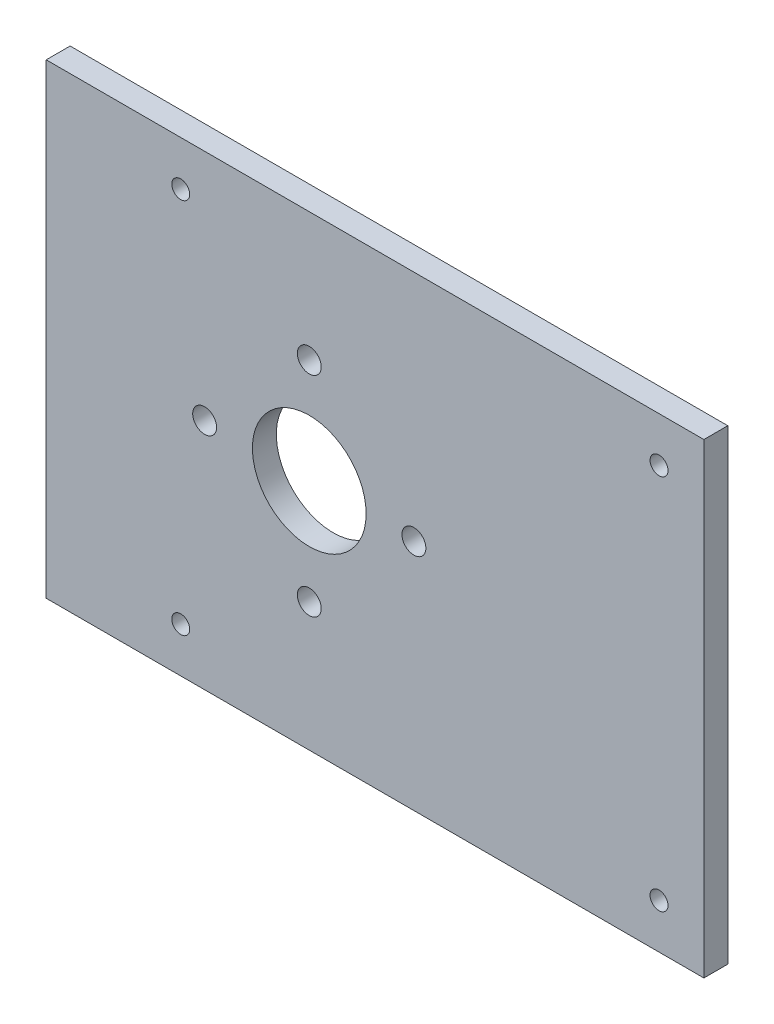
ISO-10303-21;
HEADER;
FILE_DESCRIPTION(('STEP AP214'),'2;1');
FILE_NAME('part.step','',(''),(''),'','','');
FILE_SCHEMA(('AUTOMOTIVE_DESIGN { 1 0 10303 214 1 1 1 1 }'));
ENDSEC;
DATA;
#1=APPLICATION_CONTEXT('core data for automotive mechanical design processes');
#2=APPLICATION_PROTOCOL_DEFINITION('international standard','automotive_design',2000,#1);
#3=PRODUCT_CONTEXT('',#1,'mechanical');
#4=PRODUCT('Part','Part','',(#3));
#5=PRODUCT_RELATED_PRODUCT_CATEGORY('part','',(#4));
#6=PRODUCT_DEFINITION_FORMATION('','',#4);
#7=PRODUCT_DEFINITION_CONTEXT('part definition',#1,'design');
#8=PRODUCT_DEFINITION('design','',#6,#7);
#9=PRODUCT_DEFINITION_SHAPE('','',#8);
#10=(LENGTH_UNIT() NAMED_UNIT(*) SI_UNIT(.MILLI.,.METRE.));
#11=(NAMED_UNIT(*) PLANE_ANGLE_UNIT() SI_UNIT($,.RADIAN.));
#12=(NAMED_UNIT(*) SI_UNIT($,.STERADIAN.) SOLID_ANGLE_UNIT());
#13=UNCERTAINTY_MEASURE_WITH_UNIT(LENGTH_MEASURE(1.E-05),#10,'distance_accuracy_value','');
#14=(GEOMETRIC_REPRESENTATION_CONTEXT(3) GLOBAL_UNCERTAINTY_ASSIGNED_CONTEXT((#13)) GLOBAL_UNIT_ASSIGNED_CONTEXT((#10,
#11,#12)) REPRESENTATION_CONTEXT('',''));
#15=CARTESIAN_POINT('',(0.,0.,0.));
#16=DIRECTION('',(0.,0.,1.));
#17=DIRECTION('',(1.,0.,0.));
#18=AXIS2_PLACEMENT_3D('',#15,#16,#17);
#19=CARTESIAN_POINT('',(0.,0.,4.));
#20=DIRECTION('',(0.,0.,1.));
#21=DIRECTION('',(1.,0.,0.));
#22=AXIS2_PLACEMENT_3D('',#19,#20,#21);
#23=PLANE('',#22);
#24=CARTESIAN_POINT('',(-11.,17.5,4.));
#25=DIRECTION('',(0.,0.,1.));
#26=DIRECTION('',(1.,0.,0.));
#27=AXIS2_PLACEMENT_3D('',#24,#25,#26);
#28=CIRCLE('',#27,2.);
#29=CARTESIAN_POINT('',(-9.00000000000003,17.5,4.));
#30=VERTEX_POINT('',#29);
#31=EDGE_CURVE('E153',#30,#30,#28,.T.);
#32=ORIENTED_EDGE('',*,*,#31,.F.);
#33=EDGE_LOOP('',(#32));
#34=FACE_BOUND('',#33,.T.);
#35=CARTESIAN_POINT('',(-28.5,0.,4.));
#36=DIRECTION('',(0.,0.,1.));
#37=DIRECTION('',(1.,0.,0.));
#38=AXIS2_PLACEMENT_3D('',#35,#36,#37);
#39=CIRCLE('',#38,2.);
#40=CARTESIAN_POINT('',(-26.5,0.,4.));
#41=VERTEX_POINT('',#40);
#42=EDGE_CURVE('E146',#41,#41,#39,.T.);
#43=ORIENTED_EDGE('',*,*,#42,.F.);
#44=EDGE_LOOP('',(#43));
#45=FACE_BOUND('',#44,.T.);
#46=CARTESIAN_POINT('',(-11.,-17.5,4.));
#47=DIRECTION('',(0.,0.,1.));
#48=DIRECTION('',(1.,0.,0.));
#49=AXIS2_PLACEMENT_3D('',#46,#47,#48);
#50=CIRCLE('',#49,2.);
#51=CARTESIAN_POINT('',(-9.00000000000003,-17.5,4.));
#52=VERTEX_POINT('',#51);
#53=EDGE_CURVE('E164',#52,#52,#50,.T.);
#54=ORIENTED_EDGE('',*,*,#53,.F.);
#55=EDGE_LOOP('',(#54));
#56=FACE_BOUND('',#55,.T.);
#57=CARTESIAN_POINT('',(6.49999999999997,0.,4.));
#58=DIRECTION('',(0.,0.,1.));
#59=DIRECTION('',(1.,0.,0.));
#60=AXIS2_PLACEMENT_3D('',#57,#58,#59);
#61=CIRCLE('',#60,2.);
#62=CARTESIAN_POINT('',(8.49999999999998,0.,4.));
#63=VERTEX_POINT('',#62);
#64=EDGE_CURVE('E158',#63,#63,#61,.T.);
#65=ORIENTED_EDGE('',*,*,#64,.F.);
#66=EDGE_LOOP('',(#65));
#67=FACE_BOUND('',#66,.T.);
#68=CARTESIAN_POINT('',(-11.,0.,4.));
#69=DIRECTION('',(0.,0.,1.));
#70=DIRECTION('',(1.,0.,0.));
#71=AXIS2_PLACEMENT_3D('',#68,#69,#70);
#72=CIRCLE('',#71,9.51);
#73=CARTESIAN_POINT('',(-1.49000000000003,0.,4.));
#74=VERTEX_POINT('',#73);
#75=EDGE_CURVE('E140',#74,#74,#72,.T.);
#76=ORIENTED_EDGE('',*,*,#75,.F.);
#77=EDGE_LOOP('',(#76));
#78=FACE_BOUND('',#77,.T.);
#79=CARTESIAN_POINT('',(47.5,-31.5,4.));
#80=DIRECTION('',(0.,0.,1.));
#81=DIRECTION('',(1.,0.,0.));
#82=AXIS2_PLACEMENT_3D('',#79,#80,#81);
#83=CIRCLE('',#82,1.5);
#84=CARTESIAN_POINT('',(49.,-31.5,4.));
#85=VERTEX_POINT('',#84);
#86=EDGE_CURVE('E125',#85,#85,#83,.T.);
#87=ORIENTED_EDGE('',*,*,#86,.F.);
#88=EDGE_LOOP('',(#87));
#89=FACE_BOUND('',#88,.T.);
#90=CARTESIAN_POINT('',(-32.5,31.5,4.));
#91=DIRECTION('',(0.,0.,1.));
#92=DIRECTION('',(1.,0.,0.));
#93=AXIS2_PLACEMENT_3D('',#90,#91,#92);
#94=CIRCLE('',#93,1.5);
#95=CARTESIAN_POINT('',(-31.,31.5,4.));
#96=VERTEX_POINT('',#95);
#97=EDGE_CURVE('E104',#96,#96,#94,.T.);
#98=ORIENTED_EDGE('',*,*,#97,.F.);
#99=EDGE_LOOP('',(#98));
#100=FACE_BOUND('',#99,.T.);
#101=DIRECTION('',(0.,1.,0.));
#102=VECTOR('',#101,1.);
#103=CARTESIAN_POINT('',(55.,39.,4.));
#104=LINE('',#103,#102);
#105=CARTESIAN_POINT('',(55.,-39.,4.));
#106=VERTEX_POINT('',#105);
#107=CARTESIAN_POINT('',(55.,39.,4.));
#108=VERTEX_POINT('',#107);
#109=EDGE_CURVE('E89',#106,#108,#104,.T.);
#110=ORIENTED_EDGE('',*,*,#109,.T.);
#111=DIRECTION('',(-1.,0.,0.));
#112=VECTOR('',#111,1.);
#113=CARTESIAN_POINT('',(-55.,39.,4.));
#114=LINE('',#113,#112);
#115=CARTESIAN_POINT('',(-55.,39.,4.));
#116=VERTEX_POINT('',#115);
#117=EDGE_CURVE('E84',#108,#116,#114,.T.);
#118=ORIENTED_EDGE('',*,*,#117,.T.);
#119=DIRECTION('',(0.,-1.,0.));
#120=VECTOR('',#119,1.);
#121=CARTESIAN_POINT('',(-55.,39.,4.));
#122=LINE('',#121,#120);
#123=CARTESIAN_POINT('',(-55.,-39.,4.));
#124=VERTEX_POINT('',#123);
#125=EDGE_CURVE('E87',#116,#124,#122,.T.);
#126=ORIENTED_EDGE('',*,*,#125,.T.);
#127=DIRECTION('',(1.,0.,0.));
#128=VECTOR('',#127,1.);
#129=CARTESIAN_POINT('',(-55.,-39.,4.));
#130=LINE('',#129,#128);
#131=EDGE_CURVE('E54',#124,#106,#130,.T.);
#132=ORIENTED_EDGE('',*,*,#131,.T.);
#133=EDGE_LOOP('',(#110,#118,#126,#132));
#134=FACE_BOUND('',#133,.T.);
#135=CARTESIAN_POINT('',(47.5,31.5,4.));
#136=DIRECTION('',(0.,0.,1.));
#137=DIRECTION('',(1.,0.,0.));
#138=AXIS2_PLACEMENT_3D('',#135,#136,#137);
#139=CIRCLE('',#138,1.5);
#140=CARTESIAN_POINT('',(49.,31.5,4.));
#141=VERTEX_POINT('',#140);
#142=EDGE_CURVE('E119',#141,#141,#139,.T.);
#143=ORIENTED_EDGE('',*,*,#142,.F.);
#144=EDGE_LOOP('',(#143));
#145=FACE_BOUND('',#144,.T.);
#146=CARTESIAN_POINT('',(-32.5,-31.5,4.));
#147=DIRECTION('',(0.,0.,1.));
#148=DIRECTION('',(1.,0.,0.));
#149=AXIS2_PLACEMENT_3D('',#146,#147,#148);
#150=CIRCLE('',#149,1.5);
#151=CARTESIAN_POINT('',(-31.,-31.5,4.));
#152=VERTEX_POINT('',#151);
#153=EDGE_CURVE('E131',#152,#152,#150,.T.);
#154=ORIENTED_EDGE('',*,*,#153,.F.);
#155=EDGE_LOOP('',(#154));
#156=FACE_BOUND('',#155,.T.);
#157=ADVANCED_FACE('F37',(#34,#45,#56,#67,#78,#89,#100,#134,#145,#156),#23,.T.);
#158=CARTESIAN_POINT('',(0.,0.,0.));
#159=DIRECTION('',(0.,0.,1.));
#160=DIRECTION('',(1.,0.,0.));
#161=AXIS2_PLACEMENT_3D('',#158,#159,#160);
#162=PLANE('',#161);
#163=CARTESIAN_POINT('',(-11.,17.5,0.));
#164=DIRECTION('',(0.,0.,1.));
#165=DIRECTION('',(1.,0.,0.));
#166=AXIS2_PLACEMENT_3D('',#163,#164,#165);
#167=CIRCLE('',#166,2.);
#168=CARTESIAN_POINT('',(-9.00000000000003,17.5,0.));
#169=VERTEX_POINT('',#168);
#170=EDGE_CURVE('E143',#169,#169,#167,.T.);
#171=ORIENTED_EDGE('',*,*,#170,.T.);
#172=EDGE_LOOP('',(#171));
#173=FACE_BOUND('',#172,.T.);
#174=CARTESIAN_POINT('',(-28.5,0.,0.));
#175=DIRECTION('',(0.,0.,1.));
#176=DIRECTION('',(1.,0.,0.));
#177=AXIS2_PLACEMENT_3D('',#174,#175,#176);
#178=CIRCLE('',#177,2.);
#179=CARTESIAN_POINT('',(-26.5,0.,0.));
#180=VERTEX_POINT('',#179);
#181=EDGE_CURVE('E149',#180,#180,#178,.T.);
#182=ORIENTED_EDGE('',*,*,#181,.T.);
#183=EDGE_LOOP('',(#182));
#184=FACE_BOUND('',#183,.T.);
#185=CARTESIAN_POINT('',(-11.,-17.5,0.));
#186=DIRECTION('',(0.,0.,1.));
#187=DIRECTION('',(1.,0.,0.));
#188=AXIS2_PLACEMENT_3D('',#185,#186,#187);
#189=CIRCLE('',#188,2.);
#190=CARTESIAN_POINT('',(-9.00000000000003,-17.5,0.));
#191=VERTEX_POINT('',#190);
#192=EDGE_CURVE('E150',#191,#191,#189,.T.);
#193=ORIENTED_EDGE('',*,*,#192,.T.);
#194=EDGE_LOOP('',(#193));
#195=FACE_BOUND('',#194,.T.);
#196=CARTESIAN_POINT('',(6.49999999999997,0.,0.));
#197=DIRECTION('',(0.,0.,1.));
#198=DIRECTION('',(1.,0.,0.));
#199=AXIS2_PLACEMENT_3D('',#196,#197,#198);
#200=CIRCLE('',#199,2.);
#201=CARTESIAN_POINT('',(8.49999999999998,0.,0.));
#202=VERTEX_POINT('',#201);
#203=EDGE_CURVE('E161',#202,#202,#200,.T.);
#204=ORIENTED_EDGE('',*,*,#203,.T.);
#205=EDGE_LOOP('',(#204));
#206=FACE_BOUND('',#205,.T.);
#207=CARTESIAN_POINT('',(-11.,0.,0.));
#208=DIRECTION('',(0.,0.,1.));
#209=DIRECTION('',(1.,0.,0.));
#210=AXIS2_PLACEMENT_3D('',#207,#208,#209);
#211=CIRCLE('',#210,9.51);
#212=CARTESIAN_POINT('',(-1.49000000000003,0.,0.));
#213=VERTEX_POINT('',#212);
#214=EDGE_CURVE('E137',#213,#213,#211,.T.);
#215=ORIENTED_EDGE('',*,*,#214,.T.);
#216=EDGE_LOOP('',(#215));
#217=FACE_BOUND('',#216,.T.);
#218=DIRECTION('',(0.,1.,0.));
#219=VECTOR('',#218,1.);
#220=CARTESIAN_POINT('',(55.,39.,0.));
#221=LINE('',#220,#219);
#222=CARTESIAN_POINT('',(55.,-39.,0.));
#223=VERTEX_POINT('',#222);
#224=CARTESIAN_POINT('',(55.,39.,0.));
#225=VERTEX_POINT('',#224);
#226=EDGE_CURVE('E101',#223,#225,#221,.T.);
#227=ORIENTED_EDGE('',*,*,#226,.F.);
#228=DIRECTION('',(1.,0.,0.));
#229=VECTOR('',#228,1.);
#230=CARTESIAN_POINT('',(-55.,-39.,0.));
#231=LINE('',#230,#229);
#232=CARTESIAN_POINT('',(-55.,-39.,0.));
#233=VERTEX_POINT('',#232);
#234=EDGE_CURVE('E77',#233,#223,#231,.T.);
#235=ORIENTED_EDGE('',*,*,#234,.F.);
#236=DIRECTION('',(0.,-1.,0.));
#237=VECTOR('',#236,1.);
#238=CARTESIAN_POINT('',(-55.,39.,0.));
#239=LINE('',#238,#237);
#240=CARTESIAN_POINT('',(-55.,39.,0.));
#241=VERTEX_POINT('',#240);
#242=EDGE_CURVE('E71',#241,#233,#239,.T.);
#243=ORIENTED_EDGE('',*,*,#242,.F.);
#244=DIRECTION('',(-1.,0.,0.));
#245=VECTOR('',#244,1.);
#246=CARTESIAN_POINT('',(-55.,39.,0.));
#247=LINE('',#246,#245);
#248=EDGE_CURVE('E93',#225,#241,#247,.T.);
#249=ORIENTED_EDGE('',*,*,#248,.F.);
#250=EDGE_LOOP('',(#227,#235,#243,#249));
#251=FACE_BOUND('',#250,.T.);
#252=CARTESIAN_POINT('',(-32.5,31.5,0.));
#253=DIRECTION('',(0.,0.,1.));
#254=DIRECTION('',(1.,0.,0.));
#255=AXIS2_PLACEMENT_3D('',#252,#253,#254);
#256=CIRCLE('',#255,1.5);
#257=CARTESIAN_POINT('',(-31.,31.5,0.));
#258=VERTEX_POINT('',#257);
#259=EDGE_CURVE('E116',#258,#258,#256,.T.);
#260=ORIENTED_EDGE('',*,*,#259,.T.);
#261=EDGE_LOOP('',(#260));
#262=FACE_BOUND('',#261,.T.);
#263=CARTESIAN_POINT('',(47.5,31.5,0.));
#264=DIRECTION('',(0.,0.,1.));
#265=DIRECTION('',(1.,0.,0.));
#266=AXIS2_PLACEMENT_3D('',#263,#264,#265);
#267=CIRCLE('',#266,1.5);
#268=CARTESIAN_POINT('',(49.,31.5,0.));
#269=VERTEX_POINT('',#268);
#270=EDGE_CURVE('E122',#269,#269,#267,.T.);
#271=ORIENTED_EDGE('',*,*,#270,.T.);
#272=EDGE_LOOP('',(#271));
#273=FACE_BOUND('',#272,.T.);
#274=CARTESIAN_POINT('',(47.5,-31.5,0.));
#275=DIRECTION('',(0.,0.,1.));
#276=DIRECTION('',(1.,0.,0.));
#277=AXIS2_PLACEMENT_3D('',#274,#275,#276);
#278=CIRCLE('',#277,1.5);
#279=CARTESIAN_POINT('',(49.,-31.5,0.));
#280=VERTEX_POINT('',#279);
#281=EDGE_CURVE('E128',#280,#280,#278,.T.);
#282=ORIENTED_EDGE('',*,*,#281,.T.);
#283=EDGE_LOOP('',(#282));
#284=FACE_BOUND('',#283,.T.);
#285=CARTESIAN_POINT('',(-32.5,-31.5,0.));
#286=DIRECTION('',(0.,0.,1.));
#287=DIRECTION('',(1.,0.,0.));
#288=AXIS2_PLACEMENT_3D('',#285,#286,#287);
#289=CIRCLE('',#288,1.5);
#290=CARTESIAN_POINT('',(-31.,-31.5,0.));
#291=VERTEX_POINT('',#290);
#292=EDGE_CURVE('E134',#291,#291,#289,.T.);
#293=ORIENTED_EDGE('',*,*,#292,.T.);
#294=EDGE_LOOP('',(#293));
#295=FACE_BOUND('',#294,.T.);
#296=ADVANCED_FACE('F112',(#173,#184,#195,#206,#217,#251,#262,#273,#284,#295),#162,.F.);
#297=CARTESIAN_POINT('',(55.,39.,4.));
#298=DIRECTION('',(-1.,0.,0.));
#299=DIRECTION('',(0.,-1.,0.));
#300=AXIS2_PLACEMENT_3D('',#297,#298,#299);
#301=PLANE('',#300);
#302=ORIENTED_EDGE('',*,*,#226,.T.);
#303=DIRECTION('',(0.,0.,-1.));
#304=VECTOR('',#303,1.);
#305=CARTESIAN_POINT('',(55.,39.,4.));
#306=LINE('',#305,#304);
#307=EDGE_CURVE('E11',#108,#225,#306,.T.);
#308=ORIENTED_EDGE('',*,*,#307,.F.);
#309=ORIENTED_EDGE('',*,*,#109,.F.);
#310=DIRECTION('',(0.,0.,-1.));
#311=VECTOR('',#310,1.);
#312=CARTESIAN_POINT('',(55.,-39.,4.));
#313=LINE('',#312,#311);
#314=EDGE_CURVE('E97',#106,#223,#313,.T.);
#315=ORIENTED_EDGE('',*,*,#314,.T.);
#316=EDGE_LOOP('',(#302,#308,#309,#315));
#317=FACE_BOUND('',#316,.T.);
#318=ADVANCED_FACE('F39',(#317),#301,.F.);
#319=CARTESIAN_POINT('',(-55.,39.,4.));
#320=DIRECTION('',(0.,-1.,0.));
#321=DIRECTION('',(1.,0.,0.));
#322=AXIS2_PLACEMENT_3D('',#319,#320,#321);
#323=PLANE('',#322);
#324=ORIENTED_EDGE('',*,*,#248,.T.);
#325=DIRECTION('',(0.,0.,-1.));
#326=VECTOR('',#325,1.);
#327=CARTESIAN_POINT('',(-55.,39.,4.));
#328=LINE('',#327,#326);
#329=EDGE_CURVE('E46',#116,#241,#328,.T.);
#330=ORIENTED_EDGE('',*,*,#329,.F.);
#331=ORIENTED_EDGE('',*,*,#117,.F.);
#332=ORIENTED_EDGE('',*,*,#307,.T.);
#333=EDGE_LOOP('',(#324,#330,#331,#332));
#334=FACE_BOUND('',#333,.T.);
#335=ADVANCED_FACE('F92',(#334),#323,.F.);
#336=CARTESIAN_POINT('',(-55.,39.,4.));
#337=DIRECTION('',(1.,0.,0.));
#338=DIRECTION('',(0.,0.,-1.));
#339=AXIS2_PLACEMENT_3D('',#336,#337,#338);
#340=PLANE('',#339);
#341=ORIENTED_EDGE('',*,*,#242,.T.);
#342=DIRECTION('',(0.,0.,-1.));
#343=VECTOR('',#342,1.);
#344=CARTESIAN_POINT('',(-55.,-39.,4.));
#345=LINE('',#344,#343);
#346=EDGE_CURVE('E94',#124,#233,#345,.T.);
#347=ORIENTED_EDGE('',*,*,#346,.F.);
#348=ORIENTED_EDGE('',*,*,#125,.F.);
#349=ORIENTED_EDGE('',*,*,#329,.T.);
#350=EDGE_LOOP('',(#341,#347,#348,#349));
#351=FACE_BOUND('',#350,.T.);
#352=ADVANCED_FACE('F95',(#351),#340,.F.);
#353=CARTESIAN_POINT('',(-55.,-39.,4.));
#354=DIRECTION('',(0.,1.,0.));
#355=DIRECTION('',(0.,0.,1.));
#356=AXIS2_PLACEMENT_3D('',#353,#354,#355);
#357=PLANE('',#356);
#358=ORIENTED_EDGE('',*,*,#234,.T.);
#359=ORIENTED_EDGE('',*,*,#314,.F.);
#360=ORIENTED_EDGE('',*,*,#131,.F.);
#361=ORIENTED_EDGE('',*,*,#346,.T.);
#362=EDGE_LOOP('',(#358,#359,#360,#361));
#363=FACE_BOUND('',#362,.T.);
#364=ADVANCED_FACE('F109',(#363),#357,.F.);
#365=CARTESIAN_POINT('',(-32.5,31.5,4.));
#366=DIRECTION('',(0.,0.,-1.));
#367=DIRECTION('',(-1.,0.,0.));
#368=AXIS2_PLACEMENT_3D('',#365,#366,#367);
#369=CYLINDRICAL_SURFACE('',#368,1.5);
#370=ORIENTED_EDGE('',*,*,#97,.T.);
#371=EDGE_LOOP('',(#370));
#372=FACE_BOUND('',#371,.T.);
#373=ORIENTED_EDGE('',*,*,#259,.F.);
#374=EDGE_LOOP('',(#373));
#375=FACE_BOUND('',#374,.T.);
#376=ADVANCED_FACE('F192',(#372,#375),#369,.F.);
#377=CARTESIAN_POINT('',(47.5,31.5,4.));
#378=DIRECTION('',(0.,0.,-1.));
#379=DIRECTION('',(-1.,0.,0.));
#380=AXIS2_PLACEMENT_3D('',#377,#378,#379);
#381=CYLINDRICAL_SURFACE('',#380,1.5);
#382=ORIENTED_EDGE('',*,*,#142,.T.);
#383=EDGE_LOOP('',(#382));
#384=FACE_BOUND('',#383,.T.);
#385=ORIENTED_EDGE('',*,*,#270,.F.);
#386=EDGE_LOOP('',(#385));
#387=FACE_BOUND('',#386,.T.);
#388=ADVANCED_FACE('F195',(#384,#387),#381,.F.);
#389=CARTESIAN_POINT('',(47.5,-31.5,4.));
#390=DIRECTION('',(0.,0.,-1.));
#391=DIRECTION('',(-1.,0.,0.));
#392=AXIS2_PLACEMENT_3D('',#389,#390,#391);
#393=CYLINDRICAL_SURFACE('',#392,1.5);
#394=ORIENTED_EDGE('',*,*,#86,.T.);
#395=EDGE_LOOP('',(#394));
#396=FACE_BOUND('',#395,.T.);
#397=ORIENTED_EDGE('',*,*,#281,.F.);
#398=EDGE_LOOP('',(#397));
#399=FACE_BOUND('',#398,.T.);
#400=ADVANCED_FACE('F211',(#396,#399),#393,.F.);
#401=CARTESIAN_POINT('',(-32.5,-31.5,4.));
#402=DIRECTION('',(0.,0.,-1.));
#403=DIRECTION('',(-1.,0.,0.));
#404=AXIS2_PLACEMENT_3D('',#401,#402,#403);
#405=CYLINDRICAL_SURFACE('',#404,1.5);
#406=ORIENTED_EDGE('',*,*,#153,.T.);
#407=EDGE_LOOP('',(#406));
#408=FACE_BOUND('',#407,.T.);
#409=ORIENTED_EDGE('',*,*,#292,.F.);
#410=EDGE_LOOP('',(#409));
#411=FACE_BOUND('',#410,.T.);
#412=ADVANCED_FACE('F208',(#408,#411),#405,.F.);
#413=CARTESIAN_POINT('',(-11.,0.,0.));
#414=DIRECTION('',(0.,0.,1.));
#415=DIRECTION('',(1.,0.,0.));
#416=AXIS2_PLACEMENT_3D('',#413,#414,#415);
#417=CYLINDRICAL_SURFACE('',#416,9.51);
#418=ORIENTED_EDGE('',*,*,#214,.F.);
#419=EDGE_LOOP('',(#418));
#420=FACE_BOUND('',#419,.T.);
#421=ORIENTED_EDGE('',*,*,#75,.T.);
#422=EDGE_LOOP('',(#421));
#423=FACE_BOUND('',#422,.T.);
#424=ADVANCED_FACE('F210',(#420,#423),#417,.F.);
#425=CARTESIAN_POINT('',(6.49999999999997,0.,0.));
#426=DIRECTION('',(0.,0.,1.));
#427=DIRECTION('',(1.,0.,0.));
#428=AXIS2_PLACEMENT_3D('',#425,#426,#427);
#429=CYLINDRICAL_SURFACE('',#428,2.);
#430=ORIENTED_EDGE('',*,*,#203,.F.);
#431=EDGE_LOOP('',(#430));
#432=FACE_BOUND('',#431,.T.);
#433=ORIENTED_EDGE('',*,*,#64,.T.);
#434=EDGE_LOOP('',(#433));
#435=FACE_BOUND('',#434,.T.);
#436=ADVANCED_FACE('F176',(#432,#435),#429,.F.);
#437=CARTESIAN_POINT('',(-11.,-17.5,0.));
#438=DIRECTION('',(0.,0.,1.));
#439=DIRECTION('',(1.,0.,0.));
#440=AXIS2_PLACEMENT_3D('',#437,#438,#439);
#441=CYLINDRICAL_SURFACE('',#440,2.);
#442=ORIENTED_EDGE('',*,*,#192,.F.);
#443=EDGE_LOOP('',(#442));
#444=FACE_BOUND('',#443,.T.);
#445=ORIENTED_EDGE('',*,*,#53,.T.);
#446=EDGE_LOOP('',(#445));
#447=FACE_BOUND('',#446,.T.);
#448=ADVANCED_FACE('F172',(#444,#447),#441,.F.);
#449=CARTESIAN_POINT('',(-28.5,0.,0.));
#450=DIRECTION('',(0.,0.,1.));
#451=DIRECTION('',(1.,0.,0.));
#452=AXIS2_PLACEMENT_3D('',#449,#450,#451);
#453=CYLINDRICAL_SURFACE('',#452,2.);
#454=ORIENTED_EDGE('',*,*,#181,.F.);
#455=EDGE_LOOP('',(#454));
#456=FACE_BOUND('',#455,.T.);
#457=ORIENTED_EDGE('',*,*,#42,.T.);
#458=EDGE_LOOP('',(#457));
#459=FACE_BOUND('',#458,.T.);
#460=ADVANCED_FACE('F175',(#456,#459),#453,.F.);
#461=CARTESIAN_POINT('',(-11.,17.5,0.));
#462=DIRECTION('',(0.,0.,1.));
#463=DIRECTION('',(1.,0.,0.));
#464=AXIS2_PLACEMENT_3D('',#461,#462,#463);
#465=CYLINDRICAL_SURFACE('',#464,2.);
#466=ORIENTED_EDGE('',*,*,#170,.F.);
#467=EDGE_LOOP('',(#466));
#468=FACE_BOUND('',#467,.T.);
#469=ORIENTED_EDGE('',*,*,#31,.T.);
#470=EDGE_LOOP('',(#469));
#471=FACE_BOUND('',#470,.T.);
#472=ADVANCED_FACE('F314',(#468,#471),#465,.F.);
#473=CLOSED_SHELL('',(#157,#296,#318,#335,#352,#364,#376,#388,#400,#412,#424,#436,#448,#460,#472));
#474=MANIFOLD_SOLID_BREP('B2',#473);
#475=ADVANCED_BREP_SHAPE_REPRESENTATION('',(#18,#474),#14);
#476=SHAPE_DEFINITION_REPRESENTATION(#9,#475);
ENDSEC;
END-ISO-10303-21;
